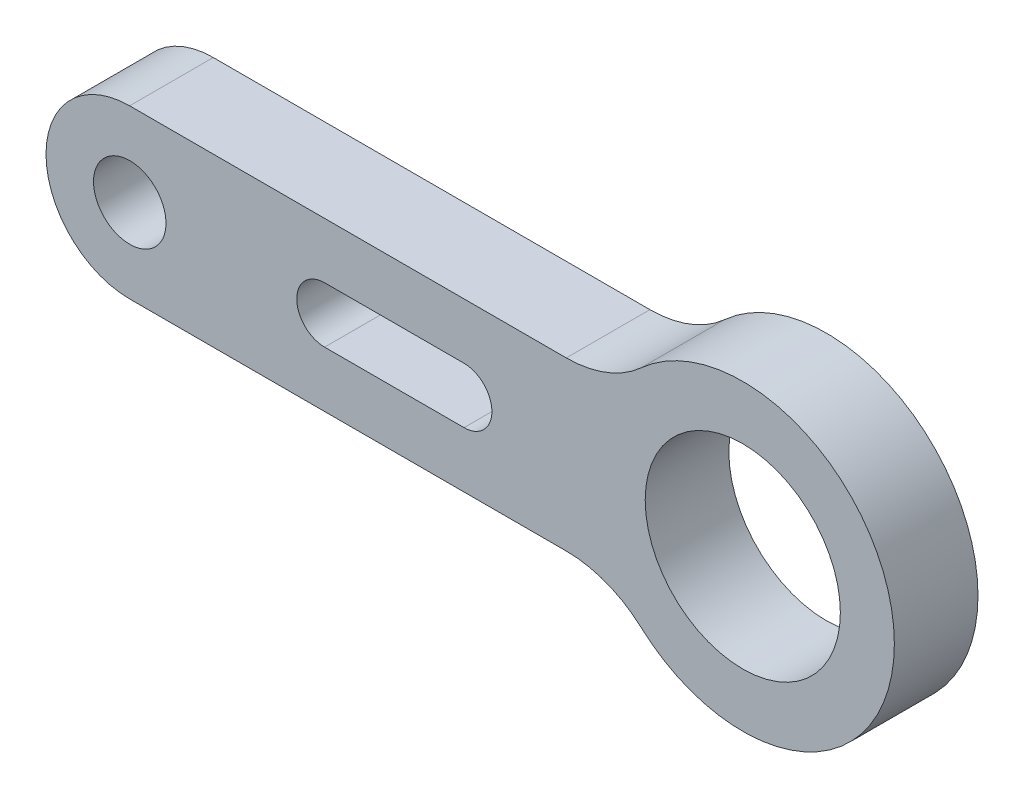
ISO-10303-21;
HEADER;
FILE_DESCRIPTION(('STEP AP214'),'2;1');
FILE_NAME('part.step','',(''),(''),'','','');
FILE_SCHEMA(('AUTOMOTIVE_DESIGN { 1 0 10303 214 1 1 1 1 }'));
ENDSEC;
DATA;
#1=APPLICATION_CONTEXT('core data for automotive mechanical design processes');
#2=APPLICATION_PROTOCOL_DEFINITION('international standard','automotive_design',2000,#1);
#3=PRODUCT_CONTEXT('',#1,'mechanical');
#4=PRODUCT('Part','Part','',(#3));
#5=PRODUCT_RELATED_PRODUCT_CATEGORY('part','',(#4));
#6=PRODUCT_DEFINITION_FORMATION('','',#4);
#7=PRODUCT_DEFINITION_CONTEXT('part definition',#1,'design');
#8=PRODUCT_DEFINITION('design','',#6,#7);
#9=PRODUCT_DEFINITION_SHAPE('','',#8);
#10=(LENGTH_UNIT() NAMED_UNIT(*) SI_UNIT(.MILLI.,.METRE.));
#11=(NAMED_UNIT(*) PLANE_ANGLE_UNIT() SI_UNIT($,.RADIAN.));
#12=(NAMED_UNIT(*) SI_UNIT($,.STERADIAN.) SOLID_ANGLE_UNIT());
#13=UNCERTAINTY_MEASURE_WITH_UNIT(LENGTH_MEASURE(1.E-05),#10,'distance_accuracy_value','');
#14=(GEOMETRIC_REPRESENTATION_CONTEXT(3) GLOBAL_UNCERTAINTY_ASSIGNED_CONTEXT((#13)) GLOBAL_UNIT_ASSIGNED_CONTEXT((#10,
#11,#12)) REPRESENTATION_CONTEXT('',''));
#15=CARTESIAN_POINT('',(0.,0.,0.));
#16=DIRECTION('',(0.,0.,1.));
#17=DIRECTION('',(1.,0.,0.));
#18=AXIS2_PLACEMENT_3D('',#15,#16,#17);
#19=CARTESIAN_POINT('',(17.5441377186444,-3.09288012735926,0.));
#20=DIRECTION('',(0.,0.,1.));
#21=DIRECTION('',(1.,0.,0.));
#22=AXIS2_PLACEMENT_3D('',#19,#20,#21);
#23=CYLINDRICAL_SURFACE('',#22,4.);
#24=CARTESIAN_POINT('',(17.5441377186444,-3.09288012735926,3.));
#25=DIRECTION('',(0.,0.,-1.));
#26=DIRECTION('',(-1.,0.,0.));
#27=AXIS2_PLACEMENT_3D('',#24,#25,#26);
#28=CIRCLE('',#27,4.);
#29=CARTESIAN_POINT('',(17.5441377186444,0.907119872640747,3.));
#30=VERTEX_POINT('',#29);
#31=CARTESIAN_POINT('',(20.2266253173634,-0.125682748902812,3.));
#32=VERTEX_POINT('',#31);
#33=EDGE_CURVE('E158',#30,#32,#28,.T.);
#34=ORIENTED_EDGE('',*,*,#33,.F.);
#35=DIRECTION('',(0.,0.,1.));
#36=VECTOR('',#35,1.);
#37=CARTESIAN_POINT('',(17.5441377186444,0.907119872640747,0.));
#38=LINE('',#37,#36);
#39=CARTESIAN_POINT('',(17.5441377186444,0.907119872640747,0.));
#40=VERTEX_POINT('',#39);
#41=EDGE_CURVE('E11',#40,#30,#38,.T.);
#42=ORIENTED_EDGE('',*,*,#41,.F.);
#43=CARTESIAN_POINT('',(17.5441377186444,-3.09288012735926,0.));
#44=DIRECTION('',(0.,0.,-1.));
#45=DIRECTION('',(-1.,0.,0.));
#46=AXIS2_PLACEMENT_3D('',#43,#44,#45);
#47=CIRCLE('',#46,4.);
#48=CARTESIAN_POINT('',(20.2266253173634,-0.125682748902812,0.));
#49=VERTEX_POINT('',#48);
#50=EDGE_CURVE('E161',#40,#49,#47,.T.);
#51=ORIENTED_EDGE('',*,*,#50,.T.);
#52=DIRECTION('',(0.,0.,1.));
#53=VECTOR('',#52,1.);
#54=CARTESIAN_POINT('',(20.2266253173634,-0.125682748902812,0.));
#55=LINE('',#54,#53);
#56=EDGE_CURVE('E40',#49,#32,#55,.T.);
#57=ORIENTED_EDGE('',*,*,#56,.T.);
#58=EDGE_LOOP('',(#34,#42,#51,#57));
#59=FACE_BOUND('',#58,.T.);
#60=ADVANCED_FACE('F37',(#59),#23,.F.);
#61=CARTESIAN_POINT('',(1.87979368641482,0.907119872640747,0.));
#62=DIRECTION('',(0.,-1.,0.));
#63=DIRECTION('',(0.,0.,-1.));
#64=AXIS2_PLACEMENT_3D('',#61,#62,#63);
#65=PLANE('',#64);
#66=DIRECTION('',(1.,0.,0.));
#67=VECTOR('',#66,1.);
#68=CARTESIAN_POINT('',(1.87979368641482,0.907119872640747,3.));
#69=LINE('',#68,#67);
#70=CARTESIAN_POINT('',(1.87979368641482,0.907119872640754,3.));
#71=VERTEX_POINT('',#70);
#72=EDGE_CURVE('E165',#71,#30,#69,.T.);
#73=ORIENTED_EDGE('',*,*,#72,.F.);
#74=DIRECTION('',(0.,0.,1.));
#75=VECTOR('',#74,1.);
#76=CARTESIAN_POINT('',(1.87979368641482,0.907119872640754,0.));
#77=LINE('',#76,#75);
#78=CARTESIAN_POINT('',(1.87979368641482,0.907119872640754,0.));
#79=VERTEX_POINT('',#78);
#80=EDGE_CURVE('E45',#79,#71,#77,.T.);
#81=ORIENTED_EDGE('',*,*,#80,.F.);
#82=DIRECTION('',(1.,0.,0.));
#83=VECTOR('',#82,1.);
#84=CARTESIAN_POINT('',(1.87979368641482,0.907119872640747,0.));
#85=LINE('',#84,#83);
#86=EDGE_CURVE('E177',#79,#40,#85,.T.);
#87=ORIENTED_EDGE('',*,*,#86,.T.);
#88=ORIENTED_EDGE('',*,*,#41,.T.);
#89=EDGE_LOOP('',(#73,#81,#87,#88));
#90=FACE_BOUND('',#89,.T.);
#91=ADVANCED_FACE('F214',(#90),#65,.T.);
#92=CARTESIAN_POINT('',(1.87979368641482,3.90711987264075,0.));
#93=DIRECTION('',(0.,0.,1.));
#94=DIRECTION('',(1.,0.,0.));
#95=AXIS2_PLACEMENT_3D('',#92,#93,#94);
#96=CYLINDRICAL_SURFACE('',#95,3.);
#97=CARTESIAN_POINT('',(1.87979368641482,3.90711987264075,3.));
#98=DIRECTION('',(0.,0.,1.));
#99=DIRECTION('',(1.,0.,0.));
#100=AXIS2_PLACEMENT_3D('',#97,#98,#99);
#101=CIRCLE('',#100,3.);
#102=CARTESIAN_POINT('',(1.87979368641482,6.90711987264075,3.));
#103=VERTEX_POINT('',#102);
#104=EDGE_CURVE('E191',#103,#71,#101,.T.);
#105=ORIENTED_EDGE('',*,*,#104,.F.);
#106=DIRECTION('',(0.,0.,1.));
#107=VECTOR('',#106,1.);
#108=CARTESIAN_POINT('',(1.87979368641482,6.90711987264075,0.));
#109=LINE('',#108,#107);
#110=CARTESIAN_POINT('',(1.87979368641482,6.90711987264075,0.));
#111=VERTEX_POINT('',#110);
#112=EDGE_CURVE('E197',#111,#103,#109,.T.);
#113=ORIENTED_EDGE('',*,*,#112,.F.);
#114=CARTESIAN_POINT('',(1.87979368641482,3.90711987264075,0.));
#115=DIRECTION('',(0.,0.,1.));
#116=DIRECTION('',(1.,0.,0.));
#117=AXIS2_PLACEMENT_3D('',#114,#115,#116);
#118=CIRCLE('',#117,3.);
#119=EDGE_CURVE('E174',#111,#79,#118,.T.);
#120=ORIENTED_EDGE('',*,*,#119,.T.);
#121=ORIENTED_EDGE('',*,*,#80,.T.);
#122=EDGE_LOOP('',(#105,#113,#120,#121));
#123=FACE_BOUND('',#122,.T.);
#124=ADVANCED_FACE('F226',(#123),#96,.T.);
#125=CARTESIAN_POINT('',(17.5427717689708,6.90711987264075,0.));
#126=DIRECTION('',(0.,1.,0.));
#127=DIRECTION('',(0.,0.,1.));
#128=AXIS2_PLACEMENT_3D('',#125,#126,#127);
#129=PLANE('',#128);
#130=DIRECTION('',(-1.,0.,0.));
#131=VECTOR('',#130,1.);
#132=CARTESIAN_POINT('',(17.5427717689708,6.90711987264075,3.));
#133=LINE('',#132,#131);
#134=CARTESIAN_POINT('',(17.5427717689708,6.90711987264074,3.));
#135=VERTEX_POINT('',#134);
#136=EDGE_CURVE('E188',#135,#103,#133,.T.);
#137=ORIENTED_EDGE('',*,*,#136,.F.);
#138=DIRECTION('',(0.,0.,1.));
#139=VECTOR('',#138,1.);
#140=CARTESIAN_POINT('',(17.5427717689708,6.90711987264074,0.));
#141=LINE('',#140,#139);
#142=CARTESIAN_POINT('',(17.5427717689708,6.90711987264074,0.));
#143=VERTEX_POINT('',#142);
#144=EDGE_CURVE('E199',#143,#135,#141,.T.);
#145=ORIENTED_EDGE('',*,*,#144,.F.);
#146=DIRECTION('',(-1.,0.,0.));
#147=VECTOR('',#146,1.);
#148=CARTESIAN_POINT('',(17.5427717689708,6.90711987264075,0.));
#149=LINE('',#148,#147);
#150=EDGE_CURVE('E171',#143,#111,#149,.T.);
#151=ORIENTED_EDGE('',*,*,#150,.T.);
#152=ORIENTED_EDGE('',*,*,#112,.T.);
#153=EDGE_LOOP('',(#137,#145,#151,#152));
#154=FACE_BOUND('',#153,.T.);
#155=ADVANCED_FACE('F224',(#154),#129,.T.);
#156=CARTESIAN_POINT('',(17.5427717689708,10.9071198726407,0.));
#157=DIRECTION('',(0.,0.,1.));
#158=DIRECTION('',(1.,0.,0.));
#159=AXIS2_PLACEMENT_3D('',#156,#157,#158);
#160=CYLINDRICAL_SURFACE('',#159,4.);
#161=CARTESIAN_POINT('',(17.5427717689708,10.9071198726407,3.));
#162=DIRECTION('',(0.,0.,-1.));
#163=DIRECTION('',(-1.,0.,0.));
#164=AXIS2_PLACEMENT_3D('',#161,#162,#163);
#165=CIRCLE('',#164,4.);
#166=CARTESIAN_POINT('',(20.225838322654,7.94044599968026,3.));
#167=VERTEX_POINT('',#166);
#168=EDGE_CURVE('E185',#167,#135,#165,.T.);
#169=ORIENTED_EDGE('',*,*,#168,.F.);
#170=DIRECTION('',(0.,0.,1.));
#171=VECTOR('',#170,1.);
#172=CARTESIAN_POINT('',(20.225838322654,7.94044599968026,0.));
#173=LINE('',#172,#171);
#174=CARTESIAN_POINT('',(20.225838322654,7.94044599968026,0.));
#175=VERTEX_POINT('',#174);
#176=EDGE_CURVE('E200',#175,#167,#173,.T.);
#177=ORIENTED_EDGE('',*,*,#176,.F.);
#178=CARTESIAN_POINT('',(17.5427717689708,10.9071198726407,0.));
#179=DIRECTION('',(0.,0.,-1.));
#180=DIRECTION('',(-1.,0.,0.));
#181=AXIS2_PLACEMENT_3D('',#178,#179,#180);
#182=CIRCLE('',#181,4.);
#183=EDGE_CURVE('E168',#175,#143,#182,.T.);
#184=ORIENTED_EDGE('',*,*,#183,.T.);
#185=ORIENTED_EDGE('',*,*,#144,.T.);
#186=EDGE_LOOP('',(#169,#177,#184,#185));
#187=FACE_BOUND('',#186,.T.);
#188=ADVANCED_FACE('F221',(#187),#160,.F.);
#189=CARTESIAN_POINT('',(23.8730290597059,3.9077374354958,0.));
#190=DIRECTION('',(0.,0.,1.));
#191=DIRECTION('',(1.,0.,0.));
#192=AXIS2_PLACEMENT_3D('',#189,#190,#191);
#193=CYLINDRICAL_SURFACE('',#192,5.43734665402926);
#194=CARTESIAN_POINT('',(23.8730290597059,3.9077374354958,3.));
#195=DIRECTION('',(0.,0.,1.));
#196=DIRECTION('',(1.,0.,0.));
#197=AXIS2_PLACEMENT_3D('',#194,#195,#196);
#198=CIRCLE('',#197,5.43734665402926);
#199=EDGE_CURVE('E182',#32,#167,#198,.T.);
#200=ORIENTED_EDGE('',*,*,#199,.F.);
#201=ORIENTED_EDGE('',*,*,#56,.F.);
#202=CARTESIAN_POINT('',(23.8730290597059,3.9077374354958,0.));
#203=DIRECTION('',(0.,0.,1.));
#204=DIRECTION('',(1.,0.,0.));
#205=AXIS2_PLACEMENT_3D('',#202,#203,#204);
#206=CIRCLE('',#205,5.43734665402926);
#207=EDGE_CURVE('E164',#49,#175,#206,.T.);
#208=ORIENTED_EDGE('',*,*,#207,.T.);
#209=ORIENTED_EDGE('',*,*,#176,.T.);
#210=EDGE_LOOP('',(#200,#201,#208,#209));
#211=FACE_BOUND('',#210,.T.);
#212=ADVANCED_FACE('F208',(#211),#193,.T.);
#213=CARTESIAN_POINT('',(17.5441377186444,-3.09288012735926,0.));
#214=DIRECTION('',(0.,0.,-1.));
#215=DIRECTION('',(-1.,0.,0.));
#216=AXIS2_PLACEMENT_3D('',#213,#214,#215);
#217=PLANE('',#216);
#218=CARTESIAN_POINT('',(1.8840290597058,3.90711987264075,0.));
#219=DIRECTION('',(0.,0.,1.));
#220=DIRECTION('',(-1.,0.,0.));
#221=AXIS2_PLACEMENT_3D('',#218,#219,#220);
#222=CIRCLE('',#221,1.3);
#223=CARTESIAN_POINT('',(0.584029059705805,3.90711987264075,0.));
#224=VERTEX_POINT('',#223);
#225=EDGE_CURVE('E145',#224,#224,#222,.T.);
#226=ORIENTED_EDGE('',*,*,#225,.T.);
#227=EDGE_LOOP('',(#226));
#228=FACE_BOUND('',#227,.T.);
#229=CARTESIAN_POINT('',(8.87402905970584,3.90738649708881,0.));
#230=DIRECTION('',(0.,0.,1.));
#231=DIRECTION('',(-1.,0.,0.));
#232=AXIS2_PLACEMENT_3D('',#229,#230,#231);
#233=CIRCLE('',#232,1.);
#234=CARTESIAN_POINT('',(8.87402905970584,4.90738649708881,0.));
#235=VERTEX_POINT('',#234);
#236=CARTESIAN_POINT('',(8.87402905970584,2.90738649708881,0.));
#237=VERTEX_POINT('',#236);
#238=EDGE_CURVE('E116',#235,#237,#233,.T.);
#239=ORIENTED_EDGE('',*,*,#238,.T.);
#240=DIRECTION('',(1.,0.,0.));
#241=VECTOR('',#240,1.);
#242=CARTESIAN_POINT('',(13.8740290597058,2.90738649708881,0.));
#243=LINE('',#242,#241);
#244=CARTESIAN_POINT('',(13.8740290597058,2.90738649708881,0.));
#245=VERTEX_POINT('',#244);
#246=EDGE_CURVE('E125',#237,#245,#243,.T.);
#247=ORIENTED_EDGE('',*,*,#246,.T.);
#248=CARTESIAN_POINT('',(13.8740290597058,3.90738649708881,0.));
#249=DIRECTION('',(0.,0.,1.));
#250=DIRECTION('',(-1.,0.,0.));
#251=AXIS2_PLACEMENT_3D('',#248,#249,#250);
#252=CIRCLE('',#251,1.);
#253=CARTESIAN_POINT('',(13.8740290597058,4.90738649708881,0.));
#254=VERTEX_POINT('',#253);
#255=EDGE_CURVE('E53',#245,#254,#252,.T.);
#256=ORIENTED_EDGE('',*,*,#255,.T.);
#257=DIRECTION('',(-1.,0.,0.));
#258=VECTOR('',#257,1.);
#259=CARTESIAN_POINT('',(8.87402905970584,4.90738649708881,0.));
#260=LINE('',#259,#258);
#261=EDGE_CURVE('E122',#254,#235,#260,.T.);
#262=ORIENTED_EDGE('',*,*,#261,.T.);
#263=EDGE_LOOP('',(#239,#247,#256,#262));
#264=FACE_BOUND('',#263,.T.);
#265=CARTESIAN_POINT('',(23.8730290597059,3.9077374354958,0.));
#266=DIRECTION('',(0.,0.,1.));
#267=DIRECTION('',(-1.,0.,0.));
#268=AXIS2_PLACEMENT_3D('',#265,#266,#267);
#269=CIRCLE('',#268,3.5);
#270=CARTESIAN_POINT('',(20.3730290597059,3.9077374354958,0.));
#271=VERTEX_POINT('',#270);
#272=EDGE_CURVE('E155',#271,#271,#269,.T.);
#273=ORIENTED_EDGE('',*,*,#272,.T.);
#274=EDGE_LOOP('',(#273));
#275=FACE_BOUND('',#274,.T.);
#276=ORIENTED_EDGE('',*,*,#50,.F.);
#277=ORIENTED_EDGE('',*,*,#86,.F.);
#278=ORIENTED_EDGE('',*,*,#119,.F.);
#279=ORIENTED_EDGE('',*,*,#150,.F.);
#280=ORIENTED_EDGE('',*,*,#183,.F.);
#281=ORIENTED_EDGE('',*,*,#207,.F.);
#282=EDGE_LOOP('',(#276,#277,#278,#279,#280,#281));
#283=FACE_BOUND('',#282,.T.);
#284=ADVANCED_FACE('F129',(#228,#264,#275,#283),#217,.T.);
#285=CARTESIAN_POINT('',(17.5441377186444,-3.09288012735926,3.));
#286=DIRECTION('',(0.,0.,-1.));
#287=DIRECTION('',(-1.,0.,0.));
#288=AXIS2_PLACEMENT_3D('',#285,#286,#287);
#289=PLANE('',#288);
#290=CARTESIAN_POINT('',(1.8840290597058,3.90711987264075,3.));
#291=DIRECTION('',(0.,0.,1.));
#292=DIRECTION('',(-1.,0.,0.));
#293=AXIS2_PLACEMENT_3D('',#290,#291,#292);
#294=CIRCLE('',#293,1.3);
#295=CARTESIAN_POINT('',(0.584029059705805,3.90711987264075,3.));
#296=VERTEX_POINT('',#295);
#297=EDGE_CURVE('E138',#296,#296,#294,.T.);
#298=ORIENTED_EDGE('',*,*,#297,.F.);
#299=EDGE_LOOP('',(#298));
#300=FACE_BOUND('',#299,.T.);
#301=DIRECTION('',(1.,0.,0.));
#302=VECTOR('',#301,1.);
#303=CARTESIAN_POINT('',(13.8740290597058,2.90738649708881,3.));
#304=LINE('',#303,#302);
#305=CARTESIAN_POINT('',(8.87402905970584,2.90738649708881,3.));
#306=VERTEX_POINT('',#305);
#307=CARTESIAN_POINT('',(13.8740290597058,2.90738649708881,3.));
#308=VERTEX_POINT('',#307);
#309=EDGE_CURVE('E144',#306,#308,#304,.T.);
#310=ORIENTED_EDGE('',*,*,#309,.F.);
#311=CARTESIAN_POINT('',(8.87402905970584,3.90738649708881,3.));
#312=DIRECTION('',(0.,0.,1.));
#313=DIRECTION('',(-1.,0.,0.));
#314=AXIS2_PLACEMENT_3D('',#311,#312,#313);
#315=CIRCLE('',#314,1.);
#316=CARTESIAN_POINT('',(8.87402905970584,4.90738649708881,3.));
#317=VERTEX_POINT('',#316);
#318=EDGE_CURVE('E61',#317,#306,#315,.T.);
#319=ORIENTED_EDGE('',*,*,#318,.F.);
#320=DIRECTION('',(-1.,0.,0.));
#321=VECTOR('',#320,1.);
#322=CARTESIAN_POINT('',(8.87402905970584,4.90738649708881,3.));
#323=LINE('',#322,#321);
#324=CARTESIAN_POINT('',(13.8740290597058,4.90738649708881,3.));
#325=VERTEX_POINT('',#324);
#326=EDGE_CURVE('E132',#325,#317,#323,.T.);
#327=ORIENTED_EDGE('',*,*,#326,.F.);
#328=CARTESIAN_POINT('',(13.8740290597058,3.90738649708881,3.));
#329=DIRECTION('',(0.,0.,1.));
#330=DIRECTION('',(-1.,0.,0.));
#331=AXIS2_PLACEMENT_3D('',#328,#329,#330);
#332=CIRCLE('',#331,1.);
#333=EDGE_CURVE('E135',#308,#325,#332,.T.);
#334=ORIENTED_EDGE('',*,*,#333,.F.);
#335=EDGE_LOOP('',(#310,#319,#327,#334));
#336=FACE_BOUND('',#335,.T.);
#337=CARTESIAN_POINT('',(23.8730290597059,3.9077374354958,3.));
#338=DIRECTION('',(0.,0.,1.));
#339=DIRECTION('',(-1.,0.,0.));
#340=AXIS2_PLACEMENT_3D('',#337,#338,#339);
#341=CIRCLE('',#340,3.5);
#342=CARTESIAN_POINT('',(20.3730290597059,3.9077374354958,3.));
#343=VERTEX_POINT('',#342);
#344=EDGE_CURVE('E151',#343,#343,#341,.T.);
#345=ORIENTED_EDGE('',*,*,#344,.F.);
#346=EDGE_LOOP('',(#345));
#347=FACE_BOUND('',#346,.T.);
#348=ORIENTED_EDGE('',*,*,#33,.T.);
#349=ORIENTED_EDGE('',*,*,#199,.T.);
#350=ORIENTED_EDGE('',*,*,#168,.T.);
#351=ORIENTED_EDGE('',*,*,#136,.T.);
#352=ORIENTED_EDGE('',*,*,#104,.T.);
#353=ORIENTED_EDGE('',*,*,#72,.T.);
#354=EDGE_LOOP('',(#348,#349,#350,#351,#352,#353));
#355=FACE_BOUND('',#354,.T.);
#356=ADVANCED_FACE('F210',(#300,#336,#347,#355),#289,.F.);
#357=CARTESIAN_POINT('',(23.8730290597059,3.9077374354958,0.));
#358=DIRECTION('',(0.,0.,1.));
#359=DIRECTION('',(1.,0.,0.));
#360=AXIS2_PLACEMENT_3D('',#357,#358,#359);
#361=CYLINDRICAL_SURFACE('',#360,3.5);
#362=ORIENTED_EDGE('',*,*,#272,.F.);
#363=EDGE_LOOP('',(#362));
#364=FACE_BOUND('',#363,.T.);
#365=ORIENTED_EDGE('',*,*,#344,.T.);
#366=EDGE_LOOP('',(#365));
#367=FACE_BOUND('',#366,.T.);
#368=ADVANCED_FACE('F285',(#364,#367),#361,.F.);
#369=CARTESIAN_POINT('',(8.87402905970584,3.90738649708881,0.));
#370=DIRECTION('',(0.,0.,1.));
#371=DIRECTION('',(1.,0.,0.));
#372=AXIS2_PLACEMENT_3D('',#369,#370,#371);
#373=CYLINDRICAL_SURFACE('',#372,1.);
#374=ORIENTED_EDGE('',*,*,#318,.T.);
#375=DIRECTION('',(0.,0.,1.));
#376=VECTOR('',#375,1.);
#377=CARTESIAN_POINT('',(8.87402905970584,2.90738649708881,0.));
#378=LINE('',#377,#376);
#379=EDGE_CURVE('E112',#237,#306,#378,.T.);
#380=ORIENTED_EDGE('',*,*,#379,.F.);
#381=ORIENTED_EDGE('',*,*,#238,.F.);
#382=DIRECTION('',(0.,0.,1.));
#383=VECTOR('',#382,1.);
#384=CARTESIAN_POINT('',(8.87402905970584,4.90738649708881,0.));
#385=LINE('',#384,#383);
#386=EDGE_CURVE('E149',#235,#317,#385,.T.);
#387=ORIENTED_EDGE('',*,*,#386,.T.);
#388=EDGE_LOOP('',(#374,#380,#381,#387));
#389=FACE_BOUND('',#388,.T.);
#390=ADVANCED_FACE('F114',(#389),#373,.F.);
#391=CARTESIAN_POINT('',(8.87402905970584,4.90738649708881,0.));
#392=DIRECTION('',(0.,1.,0.));
#393=DIRECTION('',(0.,0.,1.));
#394=AXIS2_PLACEMENT_3D('',#391,#392,#393);
#395=PLANE('',#394);
#396=ORIENTED_EDGE('',*,*,#326,.T.);
#397=ORIENTED_EDGE('',*,*,#386,.F.);
#398=ORIENTED_EDGE('',*,*,#261,.F.);
#399=DIRECTION('',(0.,0.,1.));
#400=VECTOR('',#399,1.);
#401=CARTESIAN_POINT('',(13.8740290597058,4.90738649708881,0.));
#402=LINE('',#401,#400);
#403=EDGE_CURVE('E152',#254,#325,#402,.T.);
#404=ORIENTED_EDGE('',*,*,#403,.T.);
#405=EDGE_LOOP('',(#396,#397,#398,#404));
#406=FACE_BOUND('',#405,.T.);
#407=ADVANCED_FACE('F304',(#406),#395,.F.);
#408=CARTESIAN_POINT('',(13.8740290597058,3.90738649708881,0.));
#409=DIRECTION('',(0.,0.,1.));
#410=DIRECTION('',(1.,0.,0.));
#411=AXIS2_PLACEMENT_3D('',#408,#409,#410);
#412=CYLINDRICAL_SURFACE('',#411,1.);
#413=ORIENTED_EDGE('',*,*,#333,.T.);
#414=ORIENTED_EDGE('',*,*,#403,.F.);
#415=ORIENTED_EDGE('',*,*,#255,.F.);
#416=DIRECTION('',(0.,0.,1.));
#417=VECTOR('',#416,1.);
#418=CARTESIAN_POINT('',(13.8740290597058,2.90738649708881,0.));
#419=LINE('',#418,#417);
#420=EDGE_CURVE('E121',#245,#308,#419,.T.);
#421=ORIENTED_EDGE('',*,*,#420,.T.);
#422=EDGE_LOOP('',(#413,#414,#415,#421));
#423=FACE_BOUND('',#422,.T.);
#424=ADVANCED_FACE('F313',(#423),#412,.F.);
#425=CARTESIAN_POINT('',(13.8740290597058,2.90738649708881,0.));
#426=DIRECTION('',(0.,-1.,0.));
#427=DIRECTION('',(0.,0.,-1.));
#428=AXIS2_PLACEMENT_3D('',#425,#426,#427);
#429=PLANE('',#428);
#430=ORIENTED_EDGE('',*,*,#309,.T.);
#431=ORIENTED_EDGE('',*,*,#420,.F.);
#432=ORIENTED_EDGE('',*,*,#246,.F.);
#433=ORIENTED_EDGE('',*,*,#379,.T.);
#434=EDGE_LOOP('',(#430,#431,#432,#433));
#435=FACE_BOUND('',#434,.T.);
#436=ADVANCED_FACE('F126',(#435),#429,.F.);
#437=CARTESIAN_POINT('',(1.8840290597058,3.90711987264075,0.));
#438=DIRECTION('',(0.,0.,1.));
#439=DIRECTION('',(1.,0.,0.));
#440=AXIS2_PLACEMENT_3D('',#437,#438,#439);
#441=CYLINDRICAL_SURFACE('',#440,1.3);
#442=ORIENTED_EDGE('',*,*,#225,.F.);
#443=EDGE_LOOP('',(#442));
#444=FACE_BOUND('',#443,.T.);
#445=ORIENTED_EDGE('',*,*,#297,.T.);
#446=EDGE_LOOP('',(#445));
#447=FACE_BOUND('',#446,.T.);
#448=ADVANCED_FACE('F331',(#444,#447),#441,.F.);
#449=CLOSED_SHELL('',(#60,#91,#124,#155,#188,#212,#284,#356,#368,#390,#407,#424,#436,#448));
#450=MANIFOLD_SOLID_BREP('B2',#449);
#451=ADVANCED_BREP_SHAPE_REPRESENTATION('',(#18,#450),#14);
#452=SHAPE_DEFINITION_REPRESENTATION(#9,#451);
ENDSEC;
END-ISO-10303-21;
